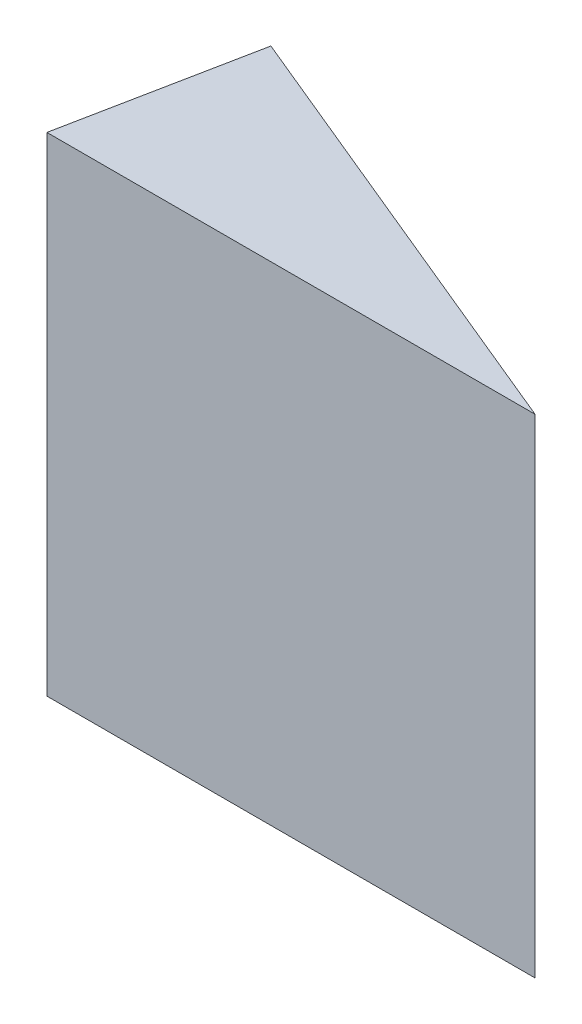
ISO-10303-21;
HEADER;
FILE_DESCRIPTION(('STEP AP214'),'2;1');
FILE_NAME('part.step','',(''),(''),'','','');
FILE_SCHEMA(('AUTOMOTIVE_DESIGN { 1 0 10303 214 1 1 1 1 }'));
ENDSEC;
DATA;
#1=APPLICATION_CONTEXT('core data for automotive mechanical design processes');
#2=APPLICATION_PROTOCOL_DEFINITION('international standard','automotive_design',2000,#1);
#3=PRODUCT_CONTEXT('',#1,'mechanical');
#4=PRODUCT('Part','Part','',(#3));
#5=PRODUCT_RELATED_PRODUCT_CATEGORY('part','',(#4));
#6=PRODUCT_DEFINITION_FORMATION('','',#4);
#7=PRODUCT_DEFINITION_CONTEXT('part definition',#1,'design');
#8=PRODUCT_DEFINITION('design','',#6,#7);
#9=PRODUCT_DEFINITION_SHAPE('','',#8);
#10=(LENGTH_UNIT() NAMED_UNIT(*) SI_UNIT(.MILLI.,.METRE.));
#11=(NAMED_UNIT(*) PLANE_ANGLE_UNIT() SI_UNIT($,.RADIAN.));
#12=(NAMED_UNIT(*) SI_UNIT($,.STERADIAN.) SOLID_ANGLE_UNIT());
#13=UNCERTAINTY_MEASURE_WITH_UNIT(LENGTH_MEASURE(1.E-05),#10,'distance_accuracy_value','');
#14=(GEOMETRIC_REPRESENTATION_CONTEXT(3) GLOBAL_UNCERTAINTY_ASSIGNED_CONTEXT((#13)) GLOBAL_UNIT_ASSIGNED_CONTEXT((#10,
#11,#12)) REPRESENTATION_CONTEXT('',''));
#15=CARTESIAN_POINT('',(0.,0.,0.));
#16=DIRECTION('',(0.,0.,1.));
#17=DIRECTION('',(1.,0.,0.));
#18=AXIS2_PLACEMENT_3D('',#15,#16,#17);
#19=CARTESIAN_POINT('',(-12.7,12.7,13.0829313718964));
#20=DIRECTION('',(0.980785280403231,0.,0.195090322016125));
#21=DIRECTION('',(0.195090322016125,0.,-0.980785280403231));
#22=AXIS2_PLACEMENT_3D('',#19,#20,#21);
#23=PLANE('',#22);
#24=DIRECTION('',(-0.195090322016125,0.,0.980785280403231));
#25=VECTOR('',#24,1.);
#26=CARTESIAN_POINT('',(-12.7,-12.7,13.0829313718964));
#27=LINE('',#26,#25);
#28=CARTESIAN_POINT('',(-10.7665401257867,-12.7,3.36277218982331));
#29=VERTEX_POINT('',#28);
#30=CARTESIAN_POINT('',(-12.7,-12.7,13.0829313718964));
#31=VERTEX_POINT('',#30);
#32=EDGE_CURVE('E89',#29,#31,#27,.T.);
#33=ORIENTED_EDGE('',*,*,#32,.T.);
#34=DIRECTION('',(0.,-1.,0.));
#35=VECTOR('',#34,1.);
#36=CARTESIAN_POINT('',(-12.7,12.7,13.0829313718964));
#37=LINE('',#36,#35);
#38=CARTESIAN_POINT('',(-12.7,12.7,13.0829313718964));
#39=VERTEX_POINT('',#38);
#40=EDGE_CURVE('E11',#39,#31,#37,.T.);
#41=ORIENTED_EDGE('',*,*,#40,.F.);
#42=DIRECTION('',(-0.195090322016125,0.,0.980785280403231));
#43=VECTOR('',#42,1.);
#44=CARTESIAN_POINT('',(-12.7,12.7,13.0829313718964));
#45=LINE('',#44,#43);
#46=CARTESIAN_POINT('',(-10.7665401257867,12.7,3.36277218982331));
#47=VERTEX_POINT('',#46);
#48=EDGE_CURVE('E81',#47,#39,#45,.T.);
#49=ORIENTED_EDGE('',*,*,#48,.F.);
#50=DIRECTION('',(0.,-1.,0.));
#51=VECTOR('',#50,1.);
#52=CARTESIAN_POINT('',(-10.7665401257867,12.7,3.36277218982331));
#53=LINE('',#52,#51);
#54=EDGE_CURVE('E90',#47,#29,#53,.T.);
#55=ORIENTED_EDGE('',*,*,#54,.T.);
#56=EDGE_LOOP('',(#33,#41,#49,#55));
#57=FACE_BOUND('',#56,.T.);
#58=ADVANCED_FACE('F39',(#57),#23,.F.);
#59=CARTESIAN_POINT('',(-12.7,12.7,13.0829313718964));
#60=DIRECTION('',(0.,0.,-1.));
#61=DIRECTION('',(-1.,0.,0.));
#62=AXIS2_PLACEMENT_3D('',#59,#60,#61);
#63=PLANE('',#62);
#64=DIRECTION('',(1.,0.,0.));
#65=VECTOR('',#64,1.);
#66=CARTESIAN_POINT('',(-12.7,-12.7,13.0829313718964));
#67=LINE('',#66,#65);
#68=CARTESIAN_POINT('',(12.7,-12.7,13.0829313718964));
#69=VERTEX_POINT('',#68);
#70=EDGE_CURVE('E68',#31,#69,#67,.T.);
#71=ORIENTED_EDGE('',*,*,#70,.T.);
#72=DIRECTION('',(0.,-1.,0.));
#73=VECTOR('',#72,1.);
#74=CARTESIAN_POINT('',(12.7,12.7,13.0829313718964));
#75=LINE('',#74,#73);
#76=CARTESIAN_POINT('',(12.7,12.7,13.0829313718964));
#77=VERTEX_POINT('',#76);
#78=EDGE_CURVE('E48',#77,#69,#75,.T.);
#79=ORIENTED_EDGE('',*,*,#78,.F.);
#80=DIRECTION('',(1.,0.,0.));
#81=VECTOR('',#80,1.);
#82=CARTESIAN_POINT('',(-12.7,12.7,13.0829313718964));
#83=LINE('',#82,#81);
#84=EDGE_CURVE('E76',#39,#77,#83,.T.);
#85=ORIENTED_EDGE('',*,*,#84,.F.);
#86=ORIENTED_EDGE('',*,*,#40,.T.);
#87=EDGE_LOOP('',(#71,#79,#85,#86));
#88=FACE_BOUND('',#87,.T.);
#89=ADVANCED_FACE('F77',(#88),#63,.F.);
#90=CARTESIAN_POINT('',(12.7,12.7,13.0829313718964));
#91=DIRECTION('',(-0.382683432365084,0.,0.923879532511289));
#92=DIRECTION('',(0.923879532511289,0.,0.382683432365084));
#93=AXIS2_PLACEMENT_3D('',#90,#91,#92);
#94=PLANE('',#93);
#95=DIRECTION('',(-0.923879532511289,0.,-0.382683432365084));
#96=VECTOR('',#95,1.);
#97=CARTESIAN_POINT('',(12.7,-12.7,13.0829313718964));
#98=LINE('',#97,#96);
#99=EDGE_CURVE('E73',#69,#29,#98,.T.);
#100=ORIENTED_EDGE('',*,*,#99,.T.);
#101=ORIENTED_EDGE('',*,*,#54,.F.);
#102=DIRECTION('',(-0.923879532511289,0.,-0.382683432365084));
#103=VECTOR('',#102,1.);
#104=CARTESIAN_POINT('',(12.7,12.7,13.0829313718964));
#105=LINE('',#104,#103);
#106=EDGE_CURVE('E56',#77,#47,#105,.T.);
#107=ORIENTED_EDGE('',*,*,#106,.F.);
#108=ORIENTED_EDGE('',*,*,#78,.T.);
#109=EDGE_LOOP('',(#100,#101,#107,#108));
#110=FACE_BOUND('',#109,.T.);
#111=ADVANCED_FACE('F102',(#110),#94,.F.);
#112=CARTESIAN_POINT('',(0.,12.7,0.));
#113=DIRECTION('',(0.,1.,0.));
#114=DIRECTION('',(0.,0.,1.));
#115=AXIS2_PLACEMENT_3D('',#112,#113,#114);
#116=PLANE('',#115);
#117=ORIENTED_EDGE('',*,*,#48,.T.);
#118=ORIENTED_EDGE('',*,*,#84,.T.);
#119=ORIENTED_EDGE('',*,*,#106,.T.);
#120=EDGE_LOOP('',(#117,#118,#119));
#121=FACE_BOUND('',#120,.T.);
#122=ADVANCED_FACE('F84',(#121),#116,.T.);
#123=CARTESIAN_POINT('',(0.,-12.7,0.));
#124=DIRECTION('',(0.,1.,0.));
#125=DIRECTION('',(0.,0.,1.));
#126=AXIS2_PLACEMENT_3D('',#123,#124,#125);
#127=PLANE('',#126);
#128=ORIENTED_EDGE('',*,*,#32,.F.);
#129=ORIENTED_EDGE('',*,*,#99,.F.);
#130=ORIENTED_EDGE('',*,*,#70,.F.);
#131=EDGE_LOOP('',(#128,#129,#130));
#132=FACE_BOUND('',#131,.T.);
#133=ADVANCED_FACE('F103',(#132),#127,.F.);
#134=CLOSED_SHELL('',(#58,#89,#111,#122,#133));
#135=MANIFOLD_SOLID_BREP('B2',#134);
#136=ADVANCED_BREP_SHAPE_REPRESENTATION('',(#18,#135),#14);
#137=SHAPE_DEFINITION_REPRESENTATION(#9,#136);
ENDSEC;
END-ISO-10303-21;
